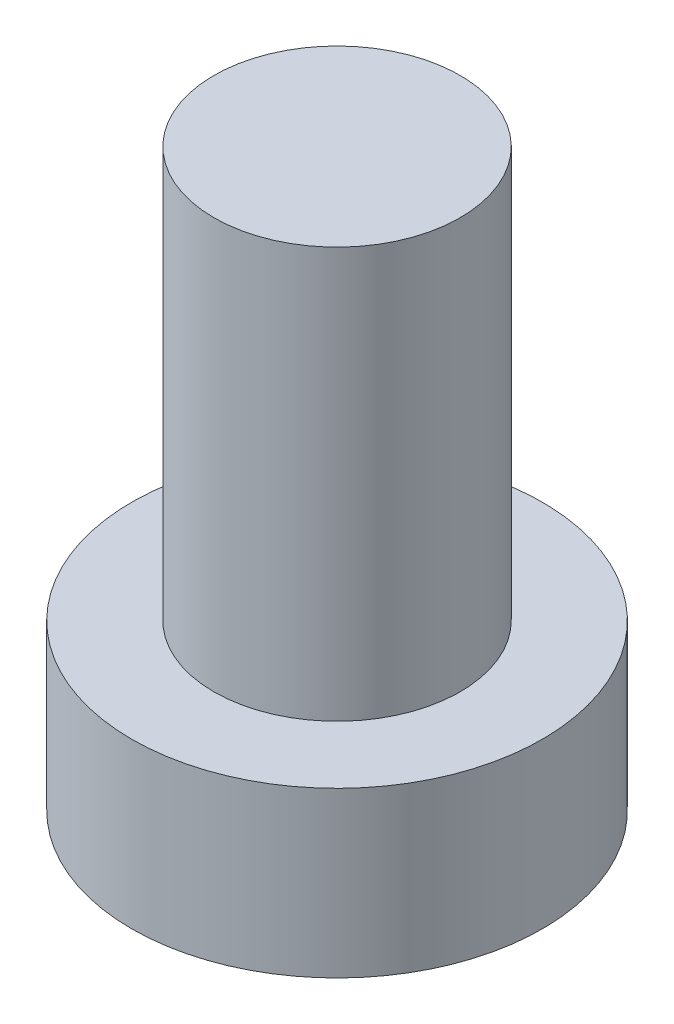
ISO-10303-21;
HEADER;
FILE_DESCRIPTION(('STEP AP214'),'2;1');
FILE_NAME('part.step','',(''),(''),'','','');
FILE_SCHEMA(('AUTOMOTIVE_DESIGN { 1 0 10303 214 1 1 1 1 }'));
ENDSEC;
DATA;
#1=APPLICATION_CONTEXT('core data for automotive mechanical design processes');
#2=APPLICATION_PROTOCOL_DEFINITION('international standard','automotive_design',2000,#1);
#3=PRODUCT_CONTEXT('',#1,'mechanical');
#4=PRODUCT('Part','Part','',(#3));
#5=PRODUCT_RELATED_PRODUCT_CATEGORY('part','',(#4));
#6=PRODUCT_DEFINITION_FORMATION('','',#4);
#7=PRODUCT_DEFINITION_CONTEXT('part definition',#1,'design');
#8=PRODUCT_DEFINITION('design','',#6,#7);
#9=PRODUCT_DEFINITION_SHAPE('','',#8);
#10=(LENGTH_UNIT() NAMED_UNIT(*) SI_UNIT(.MILLI.,.METRE.));
#11=(NAMED_UNIT(*) PLANE_ANGLE_UNIT() SI_UNIT($,.RADIAN.));
#12=(NAMED_UNIT(*) SI_UNIT($,.STERADIAN.) SOLID_ANGLE_UNIT());
#13=UNCERTAINTY_MEASURE_WITH_UNIT(LENGTH_MEASURE(1.E-05),#10,'distance_accuracy_value','');
#14=(GEOMETRIC_REPRESENTATION_CONTEXT(3) GLOBAL_UNCERTAINTY_ASSIGNED_CONTEXT((#13)) GLOBAL_UNIT_ASSIGNED_CONTEXT((#10,
#11,#12)) REPRESENTATION_CONTEXT('',''));
#15=CARTESIAN_POINT('',(0.,0.,0.));
#16=DIRECTION('',(0.,0.,1.));
#17=DIRECTION('',(1.,0.,0.));
#18=AXIS2_PLACEMENT_3D('',#15,#16,#17);
#19=CARTESIAN_POINT('',(0.,14.,0.));
#20=DIRECTION('',(0.,-1.,0.));
#21=DIRECTION('',(0.,0.,-1.));
#22=AXIS2_PLACEMENT_3D('',#19,#20,#21);
#23=CYLINDRICAL_SURFACE('',#22,5.);
#24=CARTESIAN_POINT('',(0.,0.,0.));
#25=DIRECTION('',(0.,1.,0.));
#26=DIRECTION('',(0.,0.,1.));
#27=AXIS2_PLACEMENT_3D('',#24,#25,#26);
#28=CIRCLE('',#27,5.);
#29=CARTESIAN_POINT('',(0.,0.,5.));
#30=VERTEX_POINT('',#29);
#31=EDGE_CURVE('E10',#30,#30,#28,.T.);
#32=ORIENTED_EDGE('',*,*,#31,.T.);
#33=EDGE_LOOP('',(#32));
#34=FACE_BOUND('',#33,.T.);
#35=CARTESIAN_POINT('',(0.,4.,0.));
#36=DIRECTION('',(0.,1.,0.));
#37=DIRECTION('',(0.,0.,1.));
#38=AXIS2_PLACEMENT_3D('',#35,#36,#37);
#39=CIRCLE('',#38,5.);
#40=CARTESIAN_POINT('',(0.,4.,5.));
#41=VERTEX_POINT('',#40);
#42=EDGE_CURVE('E46',#41,#41,#39,.T.);
#43=ORIENTED_EDGE('',*,*,#42,.F.);
#44=EDGE_LOOP('',(#43));
#45=FACE_BOUND('',#44,.T.);
#46=ADVANCED_FACE('F37',(#34,#45),#23,.T.);
#47=CARTESIAN_POINT('',(0.,0.,0.));
#48=DIRECTION('',(0.,1.,0.));
#49=DIRECTION('',(0.,0.,1.));
#50=AXIS2_PLACEMENT_3D('',#47,#48,#49);
#51=PLANE('',#50);
#52=ORIENTED_EDGE('',*,*,#31,.F.);
#53=EDGE_LOOP('',(#52));
#54=FACE_BOUND('',#53,.T.);
#55=ADVANCED_FACE('F75',(#54),#51,.F.);
#56=CARTESIAN_POINT('',(0.,4.,0.));
#57=DIRECTION('',(0.,1.,0.));
#58=DIRECTION('',(0.,0.,1.));
#59=AXIS2_PLACEMENT_3D('',#56,#57,#58);
#60=PLANE('',#59);
#61=CARTESIAN_POINT('',(0.,4.,0.));
#62=DIRECTION('',(0.,1.,0.));
#63=DIRECTION('',(0.,0.,1.));
#64=AXIS2_PLACEMENT_3D('',#61,#62,#63);
#65=CIRCLE('',#64,3.);
#66=CARTESIAN_POINT('',(0.,4.,3.));
#67=VERTEX_POINT('',#66);
#68=EDGE_CURVE('E49',#67,#67,#65,.T.);
#69=ORIENTED_EDGE('',*,*,#68,.F.);
#70=EDGE_LOOP('',(#69));
#71=FACE_BOUND('',#70,.T.);
#72=ORIENTED_EDGE('',*,*,#42,.T.);
#73=EDGE_LOOP('',(#72));
#74=FACE_BOUND('',#73,.T.);
#75=ADVANCED_FACE('F64',(#71,#74),#60,.T.);
#76=CARTESIAN_POINT('',(0.,4.,0.));
#77=DIRECTION('',(0.,1.,0.));
#78=DIRECTION('',(0.,0.,1.));
#79=AXIS2_PLACEMENT_3D('',#76,#77,#78);
#80=CYLINDRICAL_SURFACE('',#79,3.);
#81=ORIENTED_EDGE('',*,*,#68,.T.);
#82=EDGE_LOOP('',(#81));
#83=FACE_BOUND('',#82,.T.);
#84=CARTESIAN_POINT('',(0.,14.,0.));
#85=DIRECTION('',(0.,1.,0.));
#86=DIRECTION('',(0.,0.,1.));
#87=AXIS2_PLACEMENT_3D('',#84,#85,#86);
#88=CIRCLE('',#87,3.);
#89=CARTESIAN_POINT('',(0.,14.,3.));
#90=VERTEX_POINT('',#89);
#91=EDGE_CURVE('E53',#90,#90,#88,.T.);
#92=ORIENTED_EDGE('',*,*,#91,.F.);
#93=EDGE_LOOP('',(#92));
#94=FACE_BOUND('',#93,.T.);
#95=ADVANCED_FACE('F65',(#83,#94),#80,.T.);
#96=CARTESIAN_POINT('',(0.,14.,0.));
#97=DIRECTION('',(0.,1.,0.));
#98=DIRECTION('',(0.,0.,1.));
#99=AXIS2_PLACEMENT_3D('',#96,#97,#98);
#100=PLANE('',#99);
#101=ORIENTED_EDGE('',*,*,#91,.T.);
#102=EDGE_LOOP('',(#101));
#103=FACE_BOUND('',#102,.T.);
#104=ADVANCED_FACE('F58',(#103),#100,.T.);
#105=CLOSED_SHELL('',(#46,#55,#75,#95,#104));
#106=MANIFOLD_SOLID_BREP('B2',#105);
#107=ADVANCED_BREP_SHAPE_REPRESENTATION('',(#18,#106),#14);
#108=SHAPE_DEFINITION_REPRESENTATION(#9,#107);
ENDSEC;
END-ISO-10303-21;
